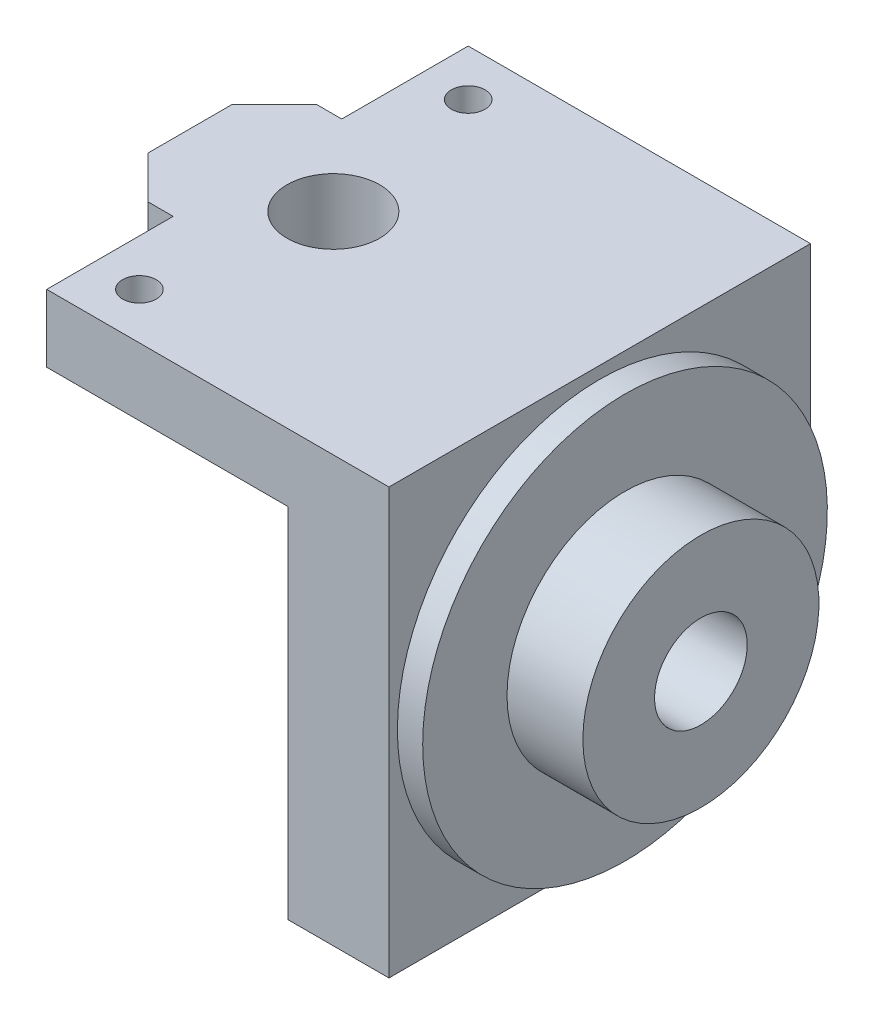
ISO-10303-21;
HEADER;
FILE_DESCRIPTION(('STEP AP214'),'2;1');
FILE_NAME('part.step','',(''),(''),'','','');
FILE_SCHEMA(('AUTOMOTIVE_DESIGN { 1 0 10303 214 1 1 1 1 }'));
ENDSEC;
DATA;
#1=APPLICATION_CONTEXT('core data for automotive mechanical design processes');
#2=APPLICATION_PROTOCOL_DEFINITION('international standard','automotive_design',2000,#1);
#3=PRODUCT_CONTEXT('',#1,'mechanical');
#4=PRODUCT('Part','Part','',(#3));
#5=PRODUCT_RELATED_PRODUCT_CATEGORY('part','',(#4));
#6=PRODUCT_DEFINITION_FORMATION('','',#4);
#7=PRODUCT_DEFINITION_CONTEXT('part definition',#1,'design');
#8=PRODUCT_DEFINITION('design','',#6,#7);
#9=PRODUCT_DEFINITION_SHAPE('','',#8);
#10=(LENGTH_UNIT() NAMED_UNIT(*) SI_UNIT(.MILLI.,.METRE.));
#11=(NAMED_UNIT(*) PLANE_ANGLE_UNIT() SI_UNIT($,.RADIAN.));
#12=(NAMED_UNIT(*) SI_UNIT($,.STERADIAN.) SOLID_ANGLE_UNIT());
#13=UNCERTAINTY_MEASURE_WITH_UNIT(LENGTH_MEASURE(1.E-05),#10,'distance_accuracy_value','');
#14=(GEOMETRIC_REPRESENTATION_CONTEXT(3) GLOBAL_UNCERTAINTY_ASSIGNED_CONTEXT((#13)) GLOBAL_UNIT_ASSIGNED_CONTEXT((#10,
#11,#12)) REPRESENTATION_CONTEXT('',''));
#15=CARTESIAN_POINT('',(0.,0.,0.));
#16=DIRECTION('',(0.,0.,1.));
#17=DIRECTION('',(1.,0.,0.));
#18=AXIS2_PLACEMENT_3D('',#15,#16,#17);
#19=CARTESIAN_POINT('',(-46.9860763337679,8.,29.5221111165664));
#20=DIRECTION('',(1.,0.,0.));
#21=DIRECTION('',(0.,0.,1.));
#22=AXIS2_PLACEMENT_3D('',#19,#20,#21);
#23=PLANE('',#22);
#24=DIRECTION('',(0.,-1.,0.));
#25=VECTOR('',#24,1.);
#26=CARTESIAN_POINT('',(-46.9860763337679,8.,14.5221111165664));
#27=LINE('',#26,#25);
#28=CARTESIAN_POINT('',(-46.9860763337679,8.,14.5221111165664));
#29=VERTEX_POINT('',#28);
#30=CARTESIAN_POINT('',(-46.9860763337679,0.,14.5221111165664));
#31=VERTEX_POINT('',#30);
#32=EDGE_CURVE('E162',#29,#31,#27,.T.);
#33=ORIENTED_EDGE('',*,*,#32,.T.);
#34=DIRECTION('',(0.,0.,-1.));
#35=VECTOR('',#34,1.);
#36=CARTESIAN_POINT('',(-46.9860763337679,0.,29.5221111165664));
#37=LINE('',#36,#35);
#38=CARTESIAN_POINT('',(-46.9860763337679,0.,29.5221111165664));
#39=VERTEX_POINT('',#38);
#40=EDGE_CURVE('E231',#39,#31,#37,.T.);
#41=ORIENTED_EDGE('',*,*,#40,.F.);
#42=DIRECTION('',(0.,-1.,0.));
#43=VECTOR('',#42,1.);
#44=CARTESIAN_POINT('',(-46.9860763337679,8.,29.5221111165664));
#45=LINE('',#44,#43);
#46=CARTESIAN_POINT('',(-46.9860763337679,8.,29.5221111165664));
#47=VERTEX_POINT('',#46);
#48=EDGE_CURVE('E244',#47,#39,#45,.T.);
#49=ORIENTED_EDGE('',*,*,#48,.F.);
#50=DIRECTION('',(0.,0.,-1.));
#51=VECTOR('',#50,1.);
#52=CARTESIAN_POINT('',(-46.9860763337679,8.,29.5221111165664));
#53=LINE('',#52,#51);
#54=EDGE_CURVE('E154',#47,#29,#53,.T.);
#55=ORIENTED_EDGE('',*,*,#54,.T.);
#56=EDGE_LOOP('',(#33,#41,#49,#55));
#57=FACE_BOUND('',#56,.T.);
#58=ADVANCED_FACE('F35',(#57),#23,.F.);
#59=DIRECTION('',(0.,1.,0.));
#60=VECTOR('',#59,1.);
#61=CARTESIAN_POINT('',(-46.9860763337679,8.,-5.47788888343363));
#62=LINE('',#61,#60);
#63=CARTESIAN_POINT('',(-46.9860763337679,0.,-5.47788888343363));
#64=VERTEX_POINT('',#63);
#65=CARTESIAN_POINT('',(-46.9860763337679,8.,-5.47788888343363));
#66=VERTEX_POINT('',#65);
#67=EDGE_CURVE('E138',#64,#66,#62,.T.);
#68=ORIENTED_EDGE('',*,*,#67,.T.);
#69=CARTESIAN_POINT('',(-46.9860763337679,8.,-20.4778888834336));
#70=VERTEX_POINT('',#69);
#71=EDGE_CURVE('E147',#66,#70,#53,.T.);
#72=ORIENTED_EDGE('',*,*,#71,.T.);
#73=DIRECTION('',(0.,-1.,0.));
#74=VECTOR('',#73,1.);
#75=CARTESIAN_POINT('',(-46.9860763337679,8.,-20.4778888834336));
#76=LINE('',#75,#74);
#77=CARTESIAN_POINT('',(-46.9860763337679,0.,-20.4778888834336));
#78=VERTEX_POINT('',#77);
#79=EDGE_CURVE('E247',#70,#78,#76,.T.);
#80=ORIENTED_EDGE('',*,*,#79,.T.);
#81=EDGE_CURVE('E160',#64,#78,#37,.T.);
#82=ORIENTED_EDGE('',*,*,#81,.F.);
#83=EDGE_LOOP('',(#68,#72,#80,#82));
#84=FACE_BOUND('',#83,.T.);
#85=ADVANCED_FACE('F158',(#84),#23,.F.);
#86=CARTESIAN_POINT('',(-3.38607633376794,-17.44,4.52211111656637));
#87=DIRECTION('',(1.,0.,0.));
#88=DIRECTION('',(0.,0.,1.));
#89=AXIS2_PLACEMENT_3D('',#86,#87,#88);
#90=PLANE('',#89);
#91=CARTESIAN_POINT('',(-3.38607633376794,-17.44,4.52211111656637));
#92=DIRECTION('',(-1.,0.,0.));
#93=DIRECTION('',(0.,0.,1.));
#94=AXIS2_PLACEMENT_3D('',#91,#92,#93);
#95=CIRCLE('',#94,24.);
#96=CARTESIAN_POINT('',(-3.38607633376794,-17.44,28.5221111165664));
#97=VERTEX_POINT('',#96);
#98=EDGE_CURVE('E189',#97,#97,#95,.T.);
#99=ORIENTED_EDGE('',*,*,#98,.F.);
#100=EDGE_LOOP('',(#99));
#101=FACE_BOUND('',#100,.T.);
#102=CARTESIAN_POINT('',(-3.38607633376794,-17.44,4.52211111656637));
#103=DIRECTION('',(-1.,0.,0.));
#104=DIRECTION('',(0.,0.,1.));
#105=AXIS2_PLACEMENT_3D('',#102,#103,#104);
#106=CIRCLE('',#105,14.);
#107=CARTESIAN_POINT('',(-3.38607633376794,-17.44,18.5221111165664));
#108=VERTEX_POINT('',#107);
#109=EDGE_CURVE('E185',#108,#108,#106,.T.);
#110=ORIENTED_EDGE('',*,*,#109,.T.);
#111=EDGE_LOOP('',(#110));
#112=FACE_BOUND('',#111,.T.);
#113=ADVANCED_FACE('F380',(#101,#112),#90,.T.);
#114=CARTESIAN_POINT('',(-6.38607633376794,8.,29.5221111165664));
#115=DIRECTION('',(-1.,0.,0.));
#116=DIRECTION('',(0.,0.,-1.));
#117=AXIS2_PLACEMENT_3D('',#114,#115,#116);
#118=PLANE('',#117);
#119=CARTESIAN_POINT('',(-6.38607633376794,-17.44,4.52211111656637));
#120=DIRECTION('',(-1.,0.,0.));
#121=DIRECTION('',(0.,0.,1.));
#122=AXIS2_PLACEMENT_3D('',#119,#120,#121);
#123=CIRCLE('',#122,24.);
#124=CARTESIAN_POINT('',(-6.38607633376794,-39.0968542494924,-5.82103463394115));
#125=VERTEX_POINT('',#124);
#126=CARTESIAN_POINT('',(-6.38607633376793,-27.7831457505075,-17.1347431329261));
#127=VERTEX_POINT('',#126);
#128=EDGE_CURVE('E194',#125,#127,#123,.T.);
#129=ORIENTED_EDGE('',*,*,#128,.T.);
#130=DIRECTION('',(0.,0.707106781186548,-0.707106781186548));
#131=VECTOR('',#130,1.);
#132=CARTESIAN_POINT('',(-6.38607633376794,-42.44,-2.47788888343357));
#133=LINE('',#132,#131);
#134=CARTESIAN_POINT('',(-6.38607633376793,-24.4399999999999,-20.4778888834336));
#135=VERTEX_POINT('',#134);
#136=EDGE_CURVE('E227',#135,#127,#133,.F.);
#137=ORIENTED_EDGE('',*,*,#136,.F.);
#138=DIRECTION('',(0.,-1.,0.));
#139=VECTOR('',#138,1.);
#140=CARTESIAN_POINT('',(-6.38607633376793,8.,-20.4778888834336));
#141=LINE('',#140,#139);
#142=CARTESIAN_POINT('',(-6.38607633376793,8.,-20.4778888834336));
#143=VERTEX_POINT('',#142);
#144=EDGE_CURVE('E249',#143,#135,#141,.T.);
#145=ORIENTED_EDGE('',*,*,#144,.F.);
#146=DIRECTION('',(0.,0.,1.));
#147=VECTOR('',#146,1.);
#148=CARTESIAN_POINT('',(-6.38607633376794,8.,29.5221111165664));
#149=LINE('',#148,#147);
#150=CARTESIAN_POINT('',(-6.38607633376794,8.,29.5221111165664));
#151=VERTEX_POINT('',#150);
#152=EDGE_CURVE('E261',#143,#151,#149,.T.);
#153=ORIENTED_EDGE('',*,*,#152,.T.);
#154=DIRECTION('',(0.,-1.,0.));
#155=VECTOR('',#154,1.);
#156=CARTESIAN_POINT('',(-6.38607633376794,8.,29.5221111165664));
#157=LINE('',#156,#155);
#158=CARTESIAN_POINT('',(-6.38607633376793,-42.44,29.5221111165664));
#159=VERTEX_POINT('',#158);
#160=EDGE_CURVE('E251',#151,#159,#157,.T.);
#161=ORIENTED_EDGE('',*,*,#160,.T.);
#162=DIRECTION('',(0.,0.,-1.));
#163=VECTOR('',#162,1.);
#164=CARTESIAN_POINT('',(-6.38607633376793,-42.44,-20.4778888834336));
#165=LINE('',#164,#163);
#166=CARTESIAN_POINT('',(-6.38607633376794,-42.44,-2.47788888343358));
#167=VERTEX_POINT('',#166);
#168=EDGE_CURVE('E195',#159,#167,#165,.T.);
#169=ORIENTED_EDGE('',*,*,#168,.T.);
#170=EDGE_CURVE('E226',#125,#167,#133,.F.);
#171=ORIENTED_EDGE('',*,*,#170,.F.);
#172=EDGE_LOOP('',(#129,#137,#145,#153,#161,#169,#171));
#173=FACE_BOUND('',#172,.T.);
#174=ADVANCED_FACE('F290',(#173),#118,.F.);
#175=CARTESIAN_POINT('',(0.,0.,0.));
#176=DIRECTION('',(0.,1.,0.));
#177=DIRECTION('',(0.,0.,-1.));
#178=AXIS2_PLACEMENT_3D('',#175,#176,#177);
#179=PLANE('',#178);
#180=CARTESIAN_POINT('',(-41.4860763337679,0.,24.0221111165664));
#181=DIRECTION('',(0.,-1.,0.));
#182=DIRECTION('',(0.,0.,-1.));
#183=AXIS2_PLACEMENT_3D('',#180,#181,#182);
#184=CIRCLE('',#183,2.);
#185=CARTESIAN_POINT('',(-41.4860763337679,0.,22.0221111165664));
#186=VERTEX_POINT('',#185);
#187=EDGE_CURVE('E337',#186,#186,#184,.T.);
#188=ORIENTED_EDGE('',*,*,#187,.F.);
#189=EDGE_LOOP('',(#188));
#190=FACE_BOUND('',#189,.T.);
#191=CARTESIAN_POINT('',(-41.4860763337679,0.,-14.9778888834336));
#192=DIRECTION('',(0.,-1.,0.));
#193=DIRECTION('',(0.,0.,-1.));
#194=AXIS2_PLACEMENT_3D('',#191,#192,#193);
#195=CIRCLE('',#194,2.);
#196=CARTESIAN_POINT('',(-41.4860763337679,0.,-16.9778888834336));
#197=VERTEX_POINT('',#196);
#198=EDGE_CURVE('E331',#197,#197,#195,.T.);
#199=ORIENTED_EDGE('',*,*,#198,.F.);
#200=EDGE_LOOP('',(#199));
#201=FACE_BOUND('',#200,.T.);
#202=CARTESIAN_POINT('',(-37.986076333768,0.,4.52211111656637));
#203=DIRECTION('',(0.,-1.,0.));
#204=DIRECTION('',(0.,0.,-1.));
#205=AXIS2_PLACEMENT_3D('',#202,#203,#204);
#206=CIRCLE('',#205,5.5);
#207=CARTESIAN_POINT('',(-37.986076333768,0.,-0.977888883433626));
#208=VERTEX_POINT('',#207);
#209=EDGE_CURVE('E168',#208,#208,#206,.T.);
#210=ORIENTED_EDGE('',*,*,#209,.F.);
#211=EDGE_LOOP('',(#210));
#212=FACE_BOUND('',#211,.T.);
#213=DIRECTION('',(0.,0.,-1.));
#214=VECTOR('',#213,1.);
#215=CARTESIAN_POINT('',(-54.9860763337679,0.,14.5221111165664));
#216=LINE('',#215,#214);
#217=CARTESIAN_POINT('',(-54.9860763337679,0.,9.52211111656635));
#218=VERTEX_POINT('',#217);
#219=CARTESIAN_POINT('',(-54.9860763337679,0.,-0.477888883433611));
#220=VERTEX_POINT('',#219);
#221=EDGE_CURVE('E161',#218,#220,#216,.T.);
#222=ORIENTED_EDGE('',*,*,#221,.T.);
#223=DIRECTION('',(-0.707106781186549,0.,0.707106781186547));
#224=VECTOR('',#223,1.);
#225=CARTESIAN_POINT('',(-54.9860763337679,0.,-0.477888883433614));
#226=LINE('',#225,#224);
#227=CARTESIAN_POINT('',(-49.9860763337679,0.,-5.47788888343363));
#228=VERTEX_POINT('',#227);
#229=EDGE_CURVE('E394',#228,#220,#226,.T.);
#230=ORIENTED_EDGE('',*,*,#229,.F.);
#231=DIRECTION('',(1.,0.,0.));
#232=VECTOR('',#231,1.);
#233=CARTESIAN_POINT('',(-54.9860763337679,0.,-5.47788888343363));
#234=LINE('',#233,#232);
#235=EDGE_CURVE('E143',#228,#64,#234,.T.);
#236=ORIENTED_EDGE('',*,*,#235,.T.);
#237=ORIENTED_EDGE('',*,*,#81,.T.);
#238=DIRECTION('',(1.,0.,0.));
#239=VECTOR('',#238,1.);
#240=CARTESIAN_POINT('',(-46.9860763337679,0.,-20.4778888834336));
#241=LINE('',#240,#239);
#242=CARTESIAN_POINT('',(-18.3860763337679,0.,-20.4778888834336));
#243=VERTEX_POINT('',#242);
#244=EDGE_CURVE('E210',#78,#243,#241,.T.);
#245=ORIENTED_EDGE('',*,*,#244,.T.);
#246=DIRECTION('',(0.,0.,1.));
#247=VECTOR('',#246,1.);
#248=CARTESIAN_POINT('',(-18.3860763337679,0.,-20.4778888834336));
#249=LINE('',#248,#247);
#250=CARTESIAN_POINT('',(-18.3860763337679,0.,29.5221111165664));
#251=VERTEX_POINT('',#250);
#252=EDGE_CURVE('E192',#243,#251,#249,.T.);
#253=ORIENTED_EDGE('',*,*,#252,.T.);
#254=DIRECTION('',(-1.,0.,0.));
#255=VECTOR('',#254,1.);
#256=CARTESIAN_POINT('',(-46.9860763337679,0.,29.5221111165664));
#257=LINE('',#256,#255);
#258=EDGE_CURVE('E155',#251,#39,#257,.T.);
#259=ORIENTED_EDGE('',*,*,#258,.T.);
#260=ORIENTED_EDGE('',*,*,#40,.T.);
#261=DIRECTION('',(1.,0.,0.));
#262=VECTOR('',#261,1.);
#263=CARTESIAN_POINT('',(-54.9860763337679,0.,14.5221111165664));
#264=LINE('',#263,#262);
#265=CARTESIAN_POINT('',(-49.9860763337679,0.,14.5221111165664));
#266=VERTEX_POINT('',#265);
#267=EDGE_CURVE('E188',#266,#31,#264,.T.);
#268=ORIENTED_EDGE('',*,*,#267,.F.);
#269=DIRECTION('',(0.707106781186549,0.,0.707106781186547));
#270=VECTOR('',#269,1.);
#271=CARTESIAN_POINT('',(-54.9860763337679,0.,9.52211111656635));
#272=LINE('',#271,#270);
#273=EDGE_CURVE('E316',#218,#266,#272,.T.);
#274=ORIENTED_EDGE('',*,*,#273,.F.);
#275=EDGE_LOOP('',(#222,#230,#236,#237,#245,#253,#259,#260,#268,#274));
#276=FACE_BOUND('',#275,.T.);
#277=ADVANCED_FACE('F273',(#190,#201,#212,#276),#179,.F.);
#278=CARTESIAN_POINT('',(-46.9860763337679,8.,-20.4778888834336));
#279=DIRECTION('',(0.,0.,1.));
#280=DIRECTION('',(-1.,0.,0.));
#281=AXIS2_PLACEMENT_3D('',#278,#279,#280);
#282=PLANE('',#281);
#283=DIRECTION('',(0.,1.,0.));
#284=VECTOR('',#283,1.);
#285=CARTESIAN_POINT('',(-18.3860763337679,-42.44,-20.4778888834336));
#286=LINE('',#285,#284);
#287=CARTESIAN_POINT('',(-18.3860763337679,-24.4399999999999,-20.4778888834336));
#288=VERTEX_POINT('',#287);
#289=EDGE_CURVE('E214',#288,#243,#286,.T.);
#290=ORIENTED_EDGE('',*,*,#289,.T.);
#291=ORIENTED_EDGE('',*,*,#244,.F.);
#292=ORIENTED_EDGE('',*,*,#79,.F.);
#293=DIRECTION('',(1.,0.,0.));
#294=VECTOR('',#293,1.);
#295=CARTESIAN_POINT('',(-46.9860763337679,8.,-20.4778888834336));
#296=LINE('',#295,#294);
#297=EDGE_CURVE('E150',#70,#143,#296,.T.);
#298=ORIENTED_EDGE('',*,*,#297,.T.);
#299=ORIENTED_EDGE('',*,*,#144,.T.);
#300=DIRECTION('',(1.,0.,0.));
#301=VECTOR('',#300,1.);
#302=CARTESIAN_POINT('',(-46.9860763337679,-24.4399999999999,-20.4778888834336));
#303=LINE('',#302,#301);
#304=EDGE_CURVE('E224',#288,#135,#303,.T.);
#305=ORIENTED_EDGE('',*,*,#304,.F.);
#306=EDGE_LOOP('',(#290,#291,#292,#298,#299,#305));
#307=FACE_BOUND('',#306,.T.);
#308=ADVANCED_FACE('F355',(#307),#282,.F.);
#309=CARTESIAN_POINT('',(-46.9860763337679,8.,29.5221111165664));
#310=DIRECTION('',(0.,0.,-1.));
#311=DIRECTION('',(1.,0.,0.));
#312=AXIS2_PLACEMENT_3D('',#309,#310,#311);
#313=PLANE('',#312);
#314=ORIENTED_EDGE('',*,*,#160,.F.);
#315=DIRECTION('',(-1.,0.,0.));
#316=VECTOR('',#315,1.);
#317=CARTESIAN_POINT('',(-46.9860763337679,8.,29.5221111165664));
#318=LINE('',#317,#316);
#319=EDGE_CURVE('E237',#151,#47,#318,.T.);
#320=ORIENTED_EDGE('',*,*,#319,.T.);
#321=ORIENTED_EDGE('',*,*,#48,.T.);
#322=ORIENTED_EDGE('',*,*,#258,.F.);
#323=DIRECTION('',(0.,1.,0.));
#324=VECTOR('',#323,1.);
#325=CARTESIAN_POINT('',(-18.3860763337679,-42.44,29.5221111165664));
#326=LINE('',#325,#324);
#327=CARTESIAN_POINT('',(-18.3860763337679,-42.44,29.5221111165664));
#328=VERTEX_POINT('',#327);
#329=EDGE_CURVE('E202',#328,#251,#326,.T.);
#330=ORIENTED_EDGE('',*,*,#329,.F.);
#331=DIRECTION('',(1.,0.,0.));
#332=VECTOR('',#331,1.);
#333=CARTESIAN_POINT('',(-6.38607633376793,-42.44,29.5221111165664));
#334=LINE('',#333,#332);
#335=EDGE_CURVE('E200',#328,#159,#334,.T.);
#336=ORIENTED_EDGE('',*,*,#335,.T.);
#337=EDGE_LOOP('',(#314,#320,#321,#322,#330,#336));
#338=FACE_BOUND('',#337,.T.);
#339=ADVANCED_FACE('F277',(#338),#313,.F.);
#340=CARTESIAN_POINT('',(0.,8.,0.));
#341=DIRECTION('',(0.,1.,0.));
#342=DIRECTION('',(0.,0.,-1.));
#343=AXIS2_PLACEMENT_3D('',#340,#341,#342);
#344=PLANE('',#343);
#345=CARTESIAN_POINT('',(-41.4860763337679,8.,24.0221111165664));
#346=DIRECTION('',(0.,-1.,0.));
#347=DIRECTION('',(0.,0.,-1.));
#348=AXIS2_PLACEMENT_3D('',#345,#346,#347);
#349=CIRCLE('',#348,2.);
#350=CARTESIAN_POINT('',(-41.4860763337679,8.,22.0221111165664));
#351=VERTEX_POINT('',#350);
#352=EDGE_CURVE('E340',#351,#351,#349,.T.);
#353=ORIENTED_EDGE('',*,*,#352,.T.);
#354=EDGE_LOOP('',(#353));
#355=FACE_BOUND('',#354,.T.);
#356=CARTESIAN_POINT('',(-41.4860763337679,8.,-14.9778888834336));
#357=DIRECTION('',(0.,-1.,0.));
#358=DIRECTION('',(0.,0.,-1.));
#359=AXIS2_PLACEMENT_3D('',#356,#357,#358);
#360=CIRCLE('',#359,2.);
#361=CARTESIAN_POINT('',(-41.4860763337679,8.,-16.9778888834336));
#362=VERTEX_POINT('',#361);
#363=EDGE_CURVE('E334',#362,#362,#360,.T.);
#364=ORIENTED_EDGE('',*,*,#363,.T.);
#365=EDGE_LOOP('',(#364));
#366=FACE_BOUND('',#365,.T.);
#367=CARTESIAN_POINT('',(-37.986076333768,8.,4.52211111656637));
#368=DIRECTION('',(0.,-1.,0.));
#369=DIRECTION('',(0.,0.,-1.));
#370=AXIS2_PLACEMENT_3D('',#367,#368,#369);
#371=CIRCLE('',#370,5.5);
#372=CARTESIAN_POINT('',(-37.986076333768,8.,-0.977888883433626));
#373=VERTEX_POINT('',#372);
#374=EDGE_CURVE('E322',#373,#373,#371,.T.);
#375=ORIENTED_EDGE('',*,*,#374,.T.);
#376=EDGE_LOOP('',(#375));
#377=FACE_BOUND('',#376,.T.);
#378=DIRECTION('',(1.,0.,0.));
#379=VECTOR('',#378,1.);
#380=CARTESIAN_POINT('',(-54.9860763337679,8.,14.5221111165664));
#381=LINE('',#380,#379);
#382=CARTESIAN_POINT('',(-49.9860763337679,8.,14.5221111165664));
#383=VERTEX_POINT('',#382);
#384=EDGE_CURVE('E144',#383,#29,#381,.T.);
#385=ORIENTED_EDGE('',*,*,#384,.T.);
#386=ORIENTED_EDGE('',*,*,#54,.F.);
#387=ORIENTED_EDGE('',*,*,#319,.F.);
#388=ORIENTED_EDGE('',*,*,#152,.F.);
#389=ORIENTED_EDGE('',*,*,#297,.F.);
#390=ORIENTED_EDGE('',*,*,#71,.F.);
#391=DIRECTION('',(1.,0.,0.));
#392=VECTOR('',#391,1.);
#393=CARTESIAN_POINT('',(-54.9860763337679,8.,-5.47788888343363));
#394=LINE('',#393,#392);
#395=CARTESIAN_POINT('',(-49.9860763337679,8.,-5.47788888343363));
#396=VERTEX_POINT('',#395);
#397=EDGE_CURVE('E133',#396,#66,#394,.T.);
#398=ORIENTED_EDGE('',*,*,#397,.F.);
#399=DIRECTION('',(0.707106781186549,0.,-0.707106781186547));
#400=VECTOR('',#399,1.);
#401=CARTESIAN_POINT('',(-27.7319826086007,8.,-27.7319826086008));
#402=LINE('',#401,#400);
#403=CARTESIAN_POINT('',(-54.986076333768,8.,-0.477888883433589));
#404=VERTEX_POINT('',#403);
#405=EDGE_CURVE('E299',#404,#396,#402,.T.);
#406=ORIENTED_EDGE('',*,*,#405,.F.);
#407=DIRECTION('',(0.,0.,1.));
#408=VECTOR('',#407,1.);
#409=CARTESIAN_POINT('',(-54.9860763337679,8.,14.5221111165664));
#410=LINE('',#409,#408);
#411=CARTESIAN_POINT('',(-54.986076333768,8.,9.52211111656634));
#412=VERTEX_POINT('',#411);
#413=EDGE_CURVE('E165',#404,#412,#410,.T.);
#414=ORIENTED_EDGE('',*,*,#413,.T.);
#415=DIRECTION('',(-0.707106781186549,0.,-0.707106781186547));
#416=VECTOR('',#415,1.);
#417=CARTESIAN_POINT('',(-32.2540937251671,8.,32.2540937251672));
#418=LINE('',#417,#416);
#419=EDGE_CURVE('E11',#383,#412,#418,.T.);
#420=ORIENTED_EDGE('',*,*,#419,.F.);
#421=EDGE_LOOP('',(#385,#386,#387,#388,#389,#390,#398,#406,#414,#420));
#422=FACE_BOUND('',#421,.T.);
#423=ADVANCED_FACE('F148',(#355,#366,#377,#422),#344,.T.);
#424=CARTESIAN_POINT('',(-18.3860763337679,-42.44,-20.4778888834336));
#425=DIRECTION('',(1.,0.,0.));
#426=DIRECTION('',(0.,0.,1.));
#427=AXIS2_PLACEMENT_3D('',#424,#425,#426);
#428=PLANE('',#427);
#429=CARTESIAN_POINT('',(-18.3860763337679,-17.44,4.52211111656637));
#430=DIRECTION('',(-1.,0.,0.));
#431=DIRECTION('',(0.,0.,1.));
#432=AXIS2_PLACEMENT_3D('',#429,#430,#431);
#433=CIRCLE('',#432,5.5);
#434=CARTESIAN_POINT('',(-18.3860763337679,-17.44,10.0221111165664));
#435=VERTEX_POINT('',#434);
#436=EDGE_CURVE('E325',#435,#435,#433,.T.);
#437=ORIENTED_EDGE('',*,*,#436,.F.);
#438=EDGE_LOOP('',(#437));
#439=FACE_BOUND('',#438,.T.);
#440=DIRECTION('',(0.,0.,1.));
#441=VECTOR('',#440,1.);
#442=CARTESIAN_POINT('',(-18.3860763337679,-42.44,-20.4778888834336));
#443=LINE('',#442,#441);
#444=CARTESIAN_POINT('',(-18.3860763337679,-42.44,-2.47788888343358));
#445=VERTEX_POINT('',#444);
#446=EDGE_CURVE('E198',#445,#328,#443,.T.);
#447=ORIENTED_EDGE('',*,*,#446,.T.);
#448=ORIENTED_EDGE('',*,*,#329,.T.);
#449=ORIENTED_EDGE('',*,*,#252,.F.);
#450=ORIENTED_EDGE('',*,*,#289,.F.);
#451=DIRECTION('',(0.,-0.707106781186548,0.707106781186548));
#452=VECTOR('',#451,1.);
#453=CARTESIAN_POINT('',(-18.3860763337679,-42.44,-2.47788888343357));
#454=LINE('',#453,#452);
#455=EDGE_CURVE('E222',#445,#288,#454,.F.);
#456=ORIENTED_EDGE('',*,*,#455,.F.);
#457=EDGE_LOOP('',(#447,#448,#449,#450,#456));
#458=FACE_BOUND('',#457,.T.);
#459=ADVANCED_FACE('F281',(#439,#458),#428,.F.);
#460=CARTESIAN_POINT('',(0.,-42.44,0.));
#461=DIRECTION('',(0.,1.,0.));
#462=DIRECTION('',(0.,0.,-1.));
#463=AXIS2_PLACEMENT_3D('',#460,#461,#462);
#464=PLANE('',#463);
#465=ORIENTED_EDGE('',*,*,#168,.F.);
#466=ORIENTED_EDGE('',*,*,#335,.F.);
#467=ORIENTED_EDGE('',*,*,#446,.F.);
#468=DIRECTION('',(-1.,0.,0.));
#469=VECTOR('',#468,1.);
#470=CARTESIAN_POINT('',(0.,-42.44,-2.47788888343357));
#471=LINE('',#470,#469);
#472=EDGE_CURVE('E219',#167,#445,#471,.T.);
#473=ORIENTED_EDGE('',*,*,#472,.F.);
#474=EDGE_LOOP('',(#465,#466,#467,#473));
#475=FACE_BOUND('',#474,.T.);
#476=ADVANCED_FACE('F286',(#475),#464,.F.);
#477=CARTESIAN_POINT('',(0.,-42.44,-2.47788888343357));
#478=DIRECTION('',(0.,0.707106781186547,0.707106781186547));
#479=DIRECTION('',(-1.,0.,0.));
#480=AXIS2_PLACEMENT_3D('',#477,#478,#479);
#481=PLANE('',#480);
#482=ORIENTED_EDGE('',*,*,#136,.T.);
#483=EDGE_CURVE('E230',#127,#125,#133,.F.);
#484=ORIENTED_EDGE('',*,*,#483,.T.);
#485=ORIENTED_EDGE('',*,*,#170,.T.);
#486=ORIENTED_EDGE('',*,*,#472,.T.);
#487=ORIENTED_EDGE('',*,*,#455,.T.);
#488=ORIENTED_EDGE('',*,*,#304,.T.);
#489=EDGE_LOOP('',(#482,#484,#485,#486,#487,#488));
#490=FACE_BOUND('',#489,.T.);
#491=ADVANCED_FACE('F384',(#490),#481,.F.);
#492=CARTESIAN_POINT('',(-6.38607633376794,-17.44,4.52211111656637));
#493=DIRECTION('',(1.,0.,0.));
#494=DIRECTION('',(0.,0.,1.));
#495=AXIS2_PLACEMENT_3D('',#492,#493,#494);
#496=PLANE('',#495);
#497=EDGE_CURVE('E184',#127,#125,#123,.T.);
#498=ORIENTED_EDGE('',*,*,#497,.T.);
#499=ORIENTED_EDGE('',*,*,#483,.F.);
#500=EDGE_LOOP('',(#498,#499));
#501=FACE_BOUND('',#500,.T.);
#502=ADVANCED_FACE('F386',(#501),#496,.F.);
#503=CARTESIAN_POINT('',(-3.38607633376794,-17.44,4.52211111656637));
#504=DIRECTION('',(-1.,0.,0.));
#505=DIRECTION('',(0.,0.,-1.));
#506=AXIS2_PLACEMENT_3D('',#503,#504,#505);
#507=CYLINDRICAL_SURFACE('',#506,24.);
#508=ORIENTED_EDGE('',*,*,#98,.T.);
#509=EDGE_LOOP('',(#508));
#510=FACE_BOUND('',#509,.T.);
#511=ORIENTED_EDGE('',*,*,#497,.F.);
#512=ORIENTED_EDGE('',*,*,#128,.F.);
#513=EDGE_LOOP('',(#511,#512));
#514=FACE_BOUND('',#513,.T.);
#515=ADVANCED_FACE('F296',(#510,#514),#507,.T.);
#516=CARTESIAN_POINT('',(5.61392366623206,-17.44,4.52211111656637));
#517=DIRECTION('',(-1.,0.,0.));
#518=DIRECTION('',(0.,0.,-1.));
#519=AXIS2_PLACEMENT_3D('',#516,#517,#518);
#520=CYLINDRICAL_SURFACE('',#519,14.);
#521=CARTESIAN_POINT('',(5.61392366623206,-17.44,4.52211111656637));
#522=DIRECTION('',(-1.,0.,0.));
#523=DIRECTION('',(0.,0.,1.));
#524=AXIS2_PLACEMENT_3D('',#521,#522,#523);
#525=CIRCLE('',#524,14.);
#526=CARTESIAN_POINT('',(5.61392366623206,-17.44,18.5221111165664));
#527=VERTEX_POINT('',#526);
#528=EDGE_CURVE('E181',#527,#527,#525,.T.);
#529=ORIENTED_EDGE('',*,*,#528,.T.);
#530=EDGE_LOOP('',(#529));
#531=FACE_BOUND('',#530,.T.);
#532=ORIENTED_EDGE('',*,*,#109,.F.);
#533=EDGE_LOOP('',(#532));
#534=FACE_BOUND('',#533,.T.);
#535=ADVANCED_FACE('F403',(#531,#534),#520,.T.);
#536=CARTESIAN_POINT('',(5.61392366623206,-17.44,4.52211111656637));
#537=DIRECTION('',(1.,0.,0.));
#538=DIRECTION('',(0.,0.,1.));
#539=AXIS2_PLACEMENT_3D('',#536,#537,#538);
#540=PLANE('',#539);
#541=CARTESIAN_POINT('',(5.61392366623206,-17.44,4.52211111656637));
#542=DIRECTION('',(-1.,0.,0.));
#543=DIRECTION('',(0.,0.,1.));
#544=AXIS2_PLACEMENT_3D('',#541,#542,#543);
#545=CIRCLE('',#544,5.5);
#546=CARTESIAN_POINT('',(5.61392366623206,-17.44,10.0221111165664));
#547=VERTEX_POINT('',#546);
#548=EDGE_CURVE('E328',#547,#547,#545,.T.);
#549=ORIENTED_EDGE('',*,*,#548,.T.);
#550=EDGE_LOOP('',(#549));
#551=FACE_BOUND('',#550,.T.);
#552=ORIENTED_EDGE('',*,*,#528,.F.);
#553=EDGE_LOOP('',(#552));
#554=FACE_BOUND('',#553,.T.);
#555=ADVANCED_FACE('F429',(#551,#554),#540,.T.);
#556=CARTESIAN_POINT('',(-54.9860763337679,8.,14.5221111165664));
#557=DIRECTION('',(0.,0.,-1.));
#558=DIRECTION('',(0.,-1.,0.));
#559=AXIS2_PLACEMENT_3D('',#556,#557,#558);
#560=PLANE('',#559);
#561=ORIENTED_EDGE('',*,*,#267,.T.);
#562=ORIENTED_EDGE('',*,*,#32,.F.);
#563=ORIENTED_EDGE('',*,*,#384,.F.);
#564=DIRECTION('',(0.,1.,0.));
#565=VECTOR('',#564,1.);
#566=CARTESIAN_POINT('',(-49.9860763337679,8.,14.5221111165664));
#567=LINE('',#566,#565);
#568=EDGE_CURVE('E43',#266,#383,#567,.T.);
#569=ORIENTED_EDGE('',*,*,#568,.F.);
#570=EDGE_LOOP('',(#561,#562,#563,#569));
#571=FACE_BOUND('',#570,.T.);
#572=ADVANCED_FACE('F268',(#571),#560,.F.);
#573=CARTESIAN_POINT('',(-54.9860763337679,8.,-5.47788888343363));
#574=DIRECTION('',(0.,0.,1.));
#575=DIRECTION('',(-1.,0.,0.));
#576=AXIS2_PLACEMENT_3D('',#573,#574,#575);
#577=PLANE('',#576);
#578=ORIENTED_EDGE('',*,*,#397,.T.);
#579=ORIENTED_EDGE('',*,*,#67,.F.);
#580=ORIENTED_EDGE('',*,*,#235,.F.);
#581=DIRECTION('',(0.,-1.,0.));
#582=VECTOR('',#581,1.);
#583=CARTESIAN_POINT('',(-49.9860763337679,0.,-5.47788888343363));
#584=LINE('',#583,#582);
#585=EDGE_CURVE('E139',#396,#228,#584,.T.);
#586=ORIENTED_EDGE('',*,*,#585,.F.);
#587=EDGE_LOOP('',(#578,#579,#580,#586));
#588=FACE_BOUND('',#587,.T.);
#589=ADVANCED_FACE('F135',(#588),#577,.F.);
#590=CARTESIAN_POINT('',(-54.9860763337679,0.,0.));
#591=DIRECTION('',(-1.,0.,0.));
#592=DIRECTION('',(0.,0.,-1.));
#593=AXIS2_PLACEMENT_3D('',#590,#591,#592);
#594=PLANE('',#593);
#595=ORIENTED_EDGE('',*,*,#413,.F.);
#596=DIRECTION('',(0.,1.,0.));
#597=VECTOR('',#596,1.);
#598=CARTESIAN_POINT('',(-54.9860763337679,8.,-0.477888883433614));
#599=LINE('',#598,#597);
#600=EDGE_CURVE('E298',#220,#404,#599,.T.);
#601=ORIENTED_EDGE('',*,*,#600,.F.);
#602=ORIENTED_EDGE('',*,*,#221,.F.);
#603=DIRECTION('',(0.,-1.,0.));
#604=VECTOR('',#603,1.);
#605=CARTESIAN_POINT('',(-54.9860763337679,0.,9.52211111656635));
#606=LINE('',#605,#604);
#607=EDGE_CURVE('E315',#412,#218,#606,.T.);
#608=ORIENTED_EDGE('',*,*,#607,.F.);
#609=EDGE_LOOP('',(#595,#601,#602,#608));
#610=FACE_BOUND('',#609,.T.);
#611=ADVANCED_FACE('F388',(#610),#594,.T.);
#612=CARTESIAN_POINT('',(-54.9860763337679,0.,-0.477888883433614));
#613=DIRECTION('',(-0.707106781186546,0.,-0.707106781186548));
#614=DIRECTION('',(0.,-1.,0.));
#615=AXIS2_PLACEMENT_3D('',#612,#613,#614);
#616=PLANE('',#615);
#617=ORIENTED_EDGE('',*,*,#229,.T.);
#618=ORIENTED_EDGE('',*,*,#600,.T.);
#619=ORIENTED_EDGE('',*,*,#405,.T.);
#620=ORIENTED_EDGE('',*,*,#585,.T.);
#621=EDGE_LOOP('',(#617,#618,#619,#620));
#622=FACE_BOUND('',#621,.T.);
#623=ADVANCED_FACE('F372',(#622),#616,.T.);
#624=CARTESIAN_POINT('',(-54.9860763337679,0.,9.52211111656635));
#625=DIRECTION('',(-0.707106781186546,0.,0.707106781186548));
#626=DIRECTION('',(0.,1.,0.));
#627=AXIS2_PLACEMENT_3D('',#624,#625,#626);
#628=PLANE('',#627);
#629=ORIENTED_EDGE('',*,*,#419,.T.);
#630=ORIENTED_EDGE('',*,*,#607,.T.);
#631=ORIENTED_EDGE('',*,*,#273,.T.);
#632=ORIENTED_EDGE('',*,*,#568,.T.);
#633=EDGE_LOOP('',(#629,#630,#631,#632));
#634=FACE_BOUND('',#633,.T.);
#635=ADVANCED_FACE('F37',(#634),#628,.T.);
#636=CARTESIAN_POINT('',(-37.986076333768,-42.440025,4.52211111656637));
#637=DIRECTION('',(0.,1.,0.));
#638=DIRECTION('',(0.,0.,-1.));
#639=AXIS2_PLACEMENT_3D('',#636,#637,#638);
#640=CYLINDRICAL_SURFACE('',#639,5.5);
#641=ORIENTED_EDGE('',*,*,#374,.F.);
#642=EDGE_LOOP('',(#641));
#643=FACE_BOUND('',#642,.T.);
#644=ORIENTED_EDGE('',*,*,#209,.T.);
#645=EDGE_LOOP('',(#644));
#646=FACE_BOUND('',#645,.T.);
#647=ADVANCED_FACE('F361',(#643,#646),#640,.F.);
#648=CARTESIAN_POINT('',(-54.986076333768,-17.44,4.52211111656636));
#649=DIRECTION('',(1.,0.,0.));
#650=DIRECTION('',(0.,0.,1.));
#651=AXIS2_PLACEMENT_3D('',#648,#649,#650);
#652=CYLINDRICAL_SURFACE('',#651,5.5);
#653=ORIENTED_EDGE('',*,*,#548,.F.);
#654=EDGE_LOOP('',(#653));
#655=FACE_BOUND('',#654,.T.);
#656=ORIENTED_EDGE('',*,*,#436,.T.);
#657=EDGE_LOOP('',(#656));
#658=FACE_BOUND('',#657,.T.);
#659=ADVANCED_FACE('F363',(#655,#658),#652,.F.);
#660=CARTESIAN_POINT('',(-41.4860763337679,-42.440025,-14.9778888834336));
#661=DIRECTION('',(0.,1.,0.));
#662=DIRECTION('',(0.,0.,-1.));
#663=AXIS2_PLACEMENT_3D('',#660,#661,#662);
#664=CYLINDRICAL_SURFACE('',#663,2.);
#665=ORIENTED_EDGE('',*,*,#363,.F.);
#666=EDGE_LOOP('',(#665));
#667=FACE_BOUND('',#666,.T.);
#668=ORIENTED_EDGE('',*,*,#198,.T.);
#669=EDGE_LOOP('',(#668));
#670=FACE_BOUND('',#669,.T.);
#671=ADVANCED_FACE('F349',(#667,#670),#664,.F.);
#672=CARTESIAN_POINT('',(-41.4860763337679,-42.440025,24.0221111165664));
#673=DIRECTION('',(0.,1.,0.));
#674=DIRECTION('',(0.,0.,-1.));
#675=AXIS2_PLACEMENT_3D('',#672,#673,#674);
#676=CYLINDRICAL_SURFACE('',#675,2.);
#677=ORIENTED_EDGE('',*,*,#352,.F.);
#678=EDGE_LOOP('',(#677));
#679=FACE_BOUND('',#678,.T.);
#680=ORIENTED_EDGE('',*,*,#187,.T.);
#681=EDGE_LOOP('',(#680));
#682=FACE_BOUND('',#681,.T.);
#683=ADVANCED_FACE('F346',(#679,#682),#676,.F.);
#684=CLOSED_SHELL('',(#58,#85,#113,#174,#277,#308,#339,#423,#459,#476,#491,#502,#515,#535,#555,
#572,#589,#611,#623,#635,#647,#659,#671,#683));
#685=MANIFOLD_SOLID_BREP('B2',#684);
#686=ADVANCED_BREP_SHAPE_REPRESENTATION('',(#18,#685),#14);
#687=SHAPE_DEFINITION_REPRESENTATION(#9,#686);
ENDSEC;
END-ISO-10303-21;
